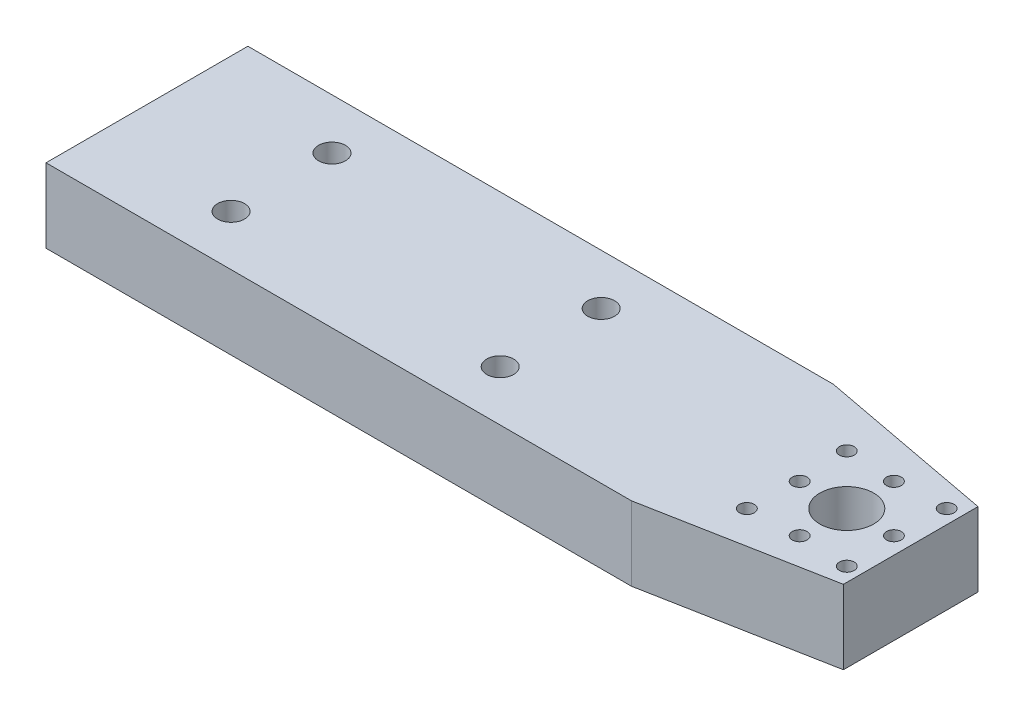
ISO-10303-21;
HEADER;
FILE_DESCRIPTION(('STEP AP214'),'2;1');
FILE_NAME('part.step','',(''),(''),'','','');
FILE_SCHEMA(('AUTOMOTIVE_DESIGN { 1 0 10303 214 1 1 1 1 }'));
ENDSEC;
DATA;
#1=APPLICATION_CONTEXT('core data for automotive mechanical design processes');
#2=APPLICATION_PROTOCOL_DEFINITION('international standard','automotive_design',2000,#1);
#3=PRODUCT_CONTEXT('',#1,'mechanical');
#4=PRODUCT('Part','Part','',(#3));
#5=PRODUCT_RELATED_PRODUCT_CATEGORY('part','',(#4));
#6=PRODUCT_DEFINITION_FORMATION('','',#4);
#7=PRODUCT_DEFINITION_CONTEXT('part definition',#1,'design');
#8=PRODUCT_DEFINITION('design','',#6,#7);
#9=PRODUCT_DEFINITION_SHAPE('','',#8);
#10=(LENGTH_UNIT() NAMED_UNIT(*) SI_UNIT(.MILLI.,.METRE.));
#11=(NAMED_UNIT(*) PLANE_ANGLE_UNIT() SI_UNIT($,.RADIAN.));
#12=(NAMED_UNIT(*) SI_UNIT($,.STERADIAN.) SOLID_ANGLE_UNIT());
#13=UNCERTAINTY_MEASURE_WITH_UNIT(LENGTH_MEASURE(1.E-05),#10,'distance_accuracy_value','');
#14=(GEOMETRIC_REPRESENTATION_CONTEXT(3) GLOBAL_UNCERTAINTY_ASSIGNED_CONTEXT((#13)) GLOBAL_UNIT_ASSIGNED_CONTEXT((#10,
#11,#12)) REPRESENTATION_CONTEXT('',''));
#15=CARTESIAN_POINT('',(0.,0.,0.));
#16=DIRECTION('',(0.,0.,1.));
#17=DIRECTION('',(1.,0.,0.));
#18=AXIS2_PLACEMENT_3D('',#15,#16,#17);
#19=CARTESIAN_POINT('',(78.8000166979834,11.,-20.));
#20=DIRECTION('',(-1.,0.,0.));
#21=DIRECTION('',(0.,0.,1.));
#22=AXIS2_PLACEMENT_3D('',#19,#20,#21);
#23=PLANE('',#22);
#24=DIRECTION('',(0.,0.,-1.));
#25=VECTOR('',#24,1.);
#26=CARTESIAN_POINT('',(78.8000166979834,0.,-20.));
#27=LINE('',#26,#25);
#28=CARTESIAN_POINT('',(78.8000166979834,0.,0.));
#29=VERTEX_POINT('',#28);
#30=CARTESIAN_POINT('',(78.8000166979834,0.,-20.));
#31=VERTEX_POINT('',#30);
#32=EDGE_CURVE('E179',#29,#31,#27,.T.);
#33=ORIENTED_EDGE('',*,*,#32,.T.);
#34=DIRECTION('',(0.,-1.,0.));
#35=VECTOR('',#34,1.);
#36=CARTESIAN_POINT('',(78.8000166979834,11.,-20.));
#37=LINE('',#36,#35);
#38=CARTESIAN_POINT('',(78.8000166979834,11.,-20.));
#39=VERTEX_POINT('',#38);
#40=EDGE_CURVE('E57',#39,#31,#37,.T.);
#41=ORIENTED_EDGE('',*,*,#40,.F.);
#42=DIRECTION('',(0.,0.,-1.));
#43=VECTOR('',#42,1.);
#44=CARTESIAN_POINT('',(78.8000166979834,11.,-20.));
#45=LINE('',#44,#43);
#46=CARTESIAN_POINT('',(78.8000166979834,11.,0.));
#47=VERTEX_POINT('',#46);
#48=EDGE_CURVE('E64',#47,#39,#45,.T.);
#49=ORIENTED_EDGE('',*,*,#48,.F.);
#50=DIRECTION('',(0.,-1.,0.));
#51=VECTOR('',#50,1.);
#52=CARTESIAN_POINT('',(78.8000166979834,11.,0.));
#53=LINE('',#52,#51);
#54=EDGE_CURVE('E12',#47,#29,#53,.T.);
#55=ORIENTED_EDGE('',*,*,#54,.T.);
#56=EDGE_LOOP('',(#33,#41,#49,#55));
#57=FACE_BOUND('',#56,.T.);
#58=ADVANCED_FACE('F48',(#57),#23,.F.);
#59=CARTESIAN_POINT('',(-41.1999833020166,11.,-10.));
#60=DIRECTION('',(0.,1.,0.));
#61=DIRECTION('',(0.,0.,1.));
#62=AXIS2_PLACEMENT_3D('',#59,#60,#61);
#63=PLANE('',#62);
#64=CARTESIAN_POINT('',(25.3000166979834,11.,-2.5));
#65=DIRECTION('',(0.,1.,0.));
#66=DIRECTION('',(0.,0.,1.));
#67=AXIS2_PLACEMENT_3D('',#64,#65,#66);
#68=CIRCLE('',#67,2.);
#69=CARTESIAN_POINT('',(25.3000166979834,11.,-0.499999999999996));
#70=VERTEX_POINT('',#69);
#71=EDGE_CURVE('E350',#70,#70,#68,.T.);
#72=ORIENTED_EDGE('',*,*,#71,.F.);
#73=EDGE_LOOP('',(#72));
#74=FACE_BOUND('',#73,.T.);
#75=CARTESIAN_POINT('',(-14.6999833020166,11.,-17.5));
#76=DIRECTION('',(0.,1.,0.));
#77=DIRECTION('',(0.,0.,1.));
#78=AXIS2_PLACEMENT_3D('',#75,#76,#77);
#79=CIRCLE('',#78,2.);
#80=CARTESIAN_POINT('',(-14.6999833020166,11.,-15.5));
#81=VERTEX_POINT('',#80);
#82=EDGE_CURVE('E355',#81,#81,#79,.T.);
#83=ORIENTED_EDGE('',*,*,#82,.F.);
#84=EDGE_LOOP('',(#83));
#85=FACE_BOUND('',#84,.T.);
#86=CARTESIAN_POINT('',(-14.6999833020166,11.,-2.49999999999999));
#87=DIRECTION('',(0.,1.,0.));
#88=DIRECTION('',(0.,0.,1.));
#89=AXIS2_PLACEMENT_3D('',#86,#87,#88);
#90=CIRCLE('',#89,2.);
#91=CARTESIAN_POINT('',(-14.6999833020166,11.,-0.499999999999992));
#92=VERTEX_POINT('',#91);
#93=EDGE_CURVE('E341',#92,#92,#90,.T.);
#94=ORIENTED_EDGE('',*,*,#93,.F.);
#95=EDGE_LOOP('',(#94));
#96=FACE_BOUND('',#95,.T.);
#97=CARTESIAN_POINT('',(25.3000166979834,11.,-17.5));
#98=DIRECTION('',(0.,1.,0.));
#99=DIRECTION('',(0.,0.,1.));
#100=AXIS2_PLACEMENT_3D('',#97,#98,#99);
#101=CIRCLE('',#100,2.);
#102=CARTESIAN_POINT('',(25.3000166979834,11.,-15.5));
#103=VERTEX_POINT('',#102);
#104=EDGE_CURVE('E130',#103,#103,#101,.T.);
#105=ORIENTED_EDGE('',*,*,#104,.F.);
#106=EDGE_LOOP('',(#105));
#107=FACE_BOUND('',#106,.T.);
#108=DIRECTION('',(0.,0.,-1.));
#109=VECTOR('',#108,1.);
#110=CARTESIAN_POINT('',(-34.6999833020166,11.,-10.));
#111=LINE('',#110,#109);
#112=CARTESIAN_POINT('',(-34.6999833020166,11.,5.));
#113=VERTEX_POINT('',#112);
#114=CARTESIAN_POINT('',(-34.6999833020166,11.,-25.));
#115=VERTEX_POINT('',#114);
#116=EDGE_CURVE('E111',#113,#115,#111,.T.);
#117=ORIENTED_EDGE('',*,*,#116,.F.);
#118=DIRECTION('',(1.,0.,0.));
#119=VECTOR('',#118,1.);
#120=CARTESIAN_POINT('',(0.,11.,4.99999999999998));
#121=LINE('',#120,#119);
#122=CARTESIAN_POINT('',(52.3000166979834,11.,4.99999999999995));
#123=VERTEX_POINT('',#122);
#124=EDGE_CURVE('E119',#113,#123,#121,.T.);
#125=ORIENTED_EDGE('',*,*,#124,.T.);
#126=DIRECTION('',(0.982661653748471,0.,-0.185407859197823));
#127=VECTOR('',#126,1.);
#128=CARTESIAN_POINT('',(2.70883522509392,11.,14.3568266929979));
#129=LINE('',#128,#127);
#130=EDGE_CURVE('E125',#123,#47,#129,.T.);
#131=ORIENTED_EDGE('',*,*,#130,.T.);
#132=ORIENTED_EDGE('',*,*,#48,.T.);
#133=DIRECTION('',(-0.982661653748471,0.,-0.185407859197823));
#134=VECTOR('',#133,1.);
#135=CARTESIAN_POINT('',(6.35269909583984,11.,-33.6693052079515));
#136=LINE('',#135,#134);
#137=CARTESIAN_POINT('',(52.3000166979834,11.,-25.));
#138=VERTEX_POINT('',#137);
#139=EDGE_CURVE('E135',#39,#138,#136,.T.);
#140=ORIENTED_EDGE('',*,*,#139,.T.);
#141=DIRECTION('',(-1.,0.,0.));
#142=VECTOR('',#141,1.);
#143=CARTESIAN_POINT('',(0.,11.,-25.));
#144=LINE('',#143,#142);
#145=EDGE_CURVE('E141',#138,#115,#144,.T.);
#146=ORIENTED_EDGE('',*,*,#145,.T.);
#147=EDGE_LOOP('',(#117,#125,#131,#132,#140,#146));
#148=FACE_BOUND('',#147,.T.);
#149=CARTESIAN_POINT('',(69.3000166979834,11.,-17.));
#150=DIRECTION('',(0.,1.,0.));
#151=DIRECTION('',(0.,0.,1.));
#152=AXIS2_PLACEMENT_3D('',#149,#150,#151);
#153=CIRCLE('',#152,1.10000000000001);
#154=CARTESIAN_POINT('',(69.3000166979834,11.,-15.9));
#155=VERTEX_POINT('',#154);
#156=EDGE_CURVE('E163',#155,#155,#153,.T.);
#157=ORIENTED_EDGE('',*,*,#156,.F.);
#158=EDGE_LOOP('',(#157));
#159=FACE_BOUND('',#158,.T.);
#160=CARTESIAN_POINT('',(76.7246379004422,11.,-17.4246212024586));
#161=DIRECTION('',(0.,1.,0.));
#162=DIRECTION('',(0.,0.,1.));
#163=AXIS2_PLACEMENT_3D('',#160,#161,#162);
#164=CIRCLE('',#163,1.10000000000001);
#165=CARTESIAN_POINT('',(76.7246379004422,11.,-16.3246212024586));
#166=VERTEX_POINT('',#165);
#167=EDGE_CURVE('E167',#166,#166,#164,.T.);
#168=ORIENTED_EDGE('',*,*,#167,.F.);
#169=EDGE_LOOP('',(#168));
#170=FACE_BOUND('',#169,.T.);
#171=CARTESIAN_POINT('',(76.3000166979834,11.,-9.99999999999998));
#172=DIRECTION('',(0.,1.,0.));
#173=DIRECTION('',(0.,0.,1.));
#174=AXIS2_PLACEMENT_3D('',#171,#172,#173);
#175=CIRCLE('',#174,1.10000000000001);
#176=CARTESIAN_POINT('',(76.3000166979834,11.,-8.89999999999998));
#177=VERTEX_POINT('',#176);
#178=EDGE_CURVE('E170',#177,#177,#175,.T.);
#179=ORIENTED_EDGE('',*,*,#178,.F.);
#180=EDGE_LOOP('',(#179));
#181=FACE_BOUND('',#180,.T.);
#182=CARTESIAN_POINT('',(76.7246379004422,11.,-2.57537879754115));
#183=DIRECTION('',(0.,1.,0.));
#184=DIRECTION('',(0.,0.,1.));
#185=AXIS2_PLACEMENT_3D('',#182,#183,#184);
#186=CIRCLE('',#185,1.10000000000001);
#187=CARTESIAN_POINT('',(76.7246379004422,11.,-1.47537879754114));
#188=VERTEX_POINT('',#187);
#189=EDGE_CURVE('E154',#188,#188,#186,.T.);
#190=ORIENTED_EDGE('',*,*,#189,.F.);
#191=EDGE_LOOP('',(#190));
#192=FACE_BOUND('',#191,.T.);
#193=CARTESIAN_POINT('',(69.3000166979834,11.,-2.99999999999999));
#194=DIRECTION('',(0.,1.,0.));
#195=DIRECTION('',(0.,0.,1.));
#196=AXIS2_PLACEMENT_3D('',#193,#194,#195);
#197=CIRCLE('',#196,1.10000000000001);
#198=CARTESIAN_POINT('',(69.3000166979834,11.,-1.89999999999999));
#199=VERTEX_POINT('',#198);
#200=EDGE_CURVE('E151',#199,#199,#197,.T.);
#201=ORIENTED_EDGE('',*,*,#200,.F.);
#202=EDGE_LOOP('',(#201));
#203=FACE_BOUND('',#202,.T.);
#204=CARTESIAN_POINT('',(61.8753954955247,11.,-2.57537879754114));
#205=DIRECTION('',(0.,1.,0.));
#206=DIRECTION('',(0.,0.,1.));
#207=AXIS2_PLACEMENT_3D('',#204,#205,#206);
#208=CIRCLE('',#207,1.10000000000001);
#209=CARTESIAN_POINT('',(61.8753954955247,11.,-1.47537879754114));
#210=VERTEX_POINT('',#209);
#211=EDGE_CURVE('E155',#210,#210,#208,.T.);
#212=ORIENTED_EDGE('',*,*,#211,.F.);
#213=EDGE_LOOP('',(#212));
#214=FACE_BOUND('',#213,.T.);
#215=CARTESIAN_POINT('',(62.3000166979834,11.,-10.));
#216=DIRECTION('',(0.,1.,0.));
#217=DIRECTION('',(0.,0.,1.));
#218=AXIS2_PLACEMENT_3D('',#215,#216,#217);
#219=CIRCLE('',#218,1.10000000000001);
#220=CARTESIAN_POINT('',(62.3000166979834,11.,-8.89999999999999));
#221=VERTEX_POINT('',#220);
#222=EDGE_CURVE('E158',#221,#221,#219,.T.);
#223=ORIENTED_EDGE('',*,*,#222,.F.);
#224=EDGE_LOOP('',(#223));
#225=FACE_BOUND('',#224,.T.);
#226=CARTESIAN_POINT('',(69.3000166979834,11.,-10.));
#227=DIRECTION('',(0.,1.,0.));
#228=DIRECTION('',(0.,0.,1.));
#229=AXIS2_PLACEMENT_3D('',#226,#227,#228);
#230=CIRCLE('',#229,4.00000000000001);
#231=CARTESIAN_POINT('',(69.3000166979834,11.,-5.99999999999999));
#232=VERTEX_POINT('',#231);
#233=EDGE_CURVE('E150',#232,#232,#230,.T.);
#234=ORIENTED_EDGE('',*,*,#233,.F.);
#235=EDGE_LOOP('',(#234));
#236=FACE_BOUND('',#235,.T.);
#237=CARTESIAN_POINT('',(61.8753954955247,11.,-17.4246212024586));
#238=DIRECTION('',(0.,1.,0.));
#239=DIRECTION('',(0.,0.,1.));
#240=AXIS2_PLACEMENT_3D('',#237,#238,#239);
#241=CIRCLE('',#240,1.10000000000001);
#242=CARTESIAN_POINT('',(61.8753954955247,11.,-16.3246212024586));
#243=VERTEX_POINT('',#242);
#244=EDGE_CURVE('E166',#243,#243,#241,.T.);
#245=ORIENTED_EDGE('',*,*,#244,.F.);
#246=EDGE_LOOP('',(#245));
#247=FACE_BOUND('',#246,.T.);
#248=ADVANCED_FACE('F226',(#74,#85,#96,#107,#148,#159,#170,#181,#192,#203,#214,#225,#236,#247),
#63,.T.);
#249=CARTESIAN_POINT('',(-41.1999833020166,0.,-10.));
#250=DIRECTION('',(0.,1.,0.));
#251=DIRECTION('',(0.,0.,1.));
#252=AXIS2_PLACEMENT_3D('',#249,#250,#251);
#253=PLANE('',#252);
#254=CARTESIAN_POINT('',(25.3000166979834,0.,-2.5));
#255=DIRECTION('',(0.,1.,0.));
#256=DIRECTION('',(0.,0.,1.));
#257=AXIS2_PLACEMENT_3D('',#254,#255,#256);
#258=CIRCLE('',#257,2.);
#259=CARTESIAN_POINT('',(25.3000166979834,0.,-0.499999999999996));
#260=VERTEX_POINT('',#259);
#261=EDGE_CURVE('E353',#260,#260,#258,.T.);
#262=ORIENTED_EDGE('',*,*,#261,.T.);
#263=EDGE_LOOP('',(#262));
#264=FACE_BOUND('',#263,.T.);
#265=CARTESIAN_POINT('',(-14.6999833020166,0.,-17.5));
#266=DIRECTION('',(0.,1.,0.));
#267=DIRECTION('',(0.,0.,1.));
#268=AXIS2_PLACEMENT_3D('',#265,#266,#267);
#269=CIRCLE('',#268,2.);
#270=CARTESIAN_POINT('',(-14.6999833020166,0.,-15.5));
#271=VERTEX_POINT('',#270);
#272=EDGE_CURVE('E347',#271,#271,#269,.T.);
#273=ORIENTED_EDGE('',*,*,#272,.T.);
#274=EDGE_LOOP('',(#273));
#275=FACE_BOUND('',#274,.T.);
#276=CARTESIAN_POINT('',(-14.6999833020166,0.,-2.49999999999999));
#277=DIRECTION('',(0.,1.,0.));
#278=DIRECTION('',(0.,0.,1.));
#279=AXIS2_PLACEMENT_3D('',#276,#277,#278);
#280=CIRCLE('',#279,2.);
#281=CARTESIAN_POINT('',(-14.6999833020166,0.,-0.499999999999992));
#282=VERTEX_POINT('',#281);
#283=EDGE_CURVE('E344',#282,#282,#280,.T.);
#284=ORIENTED_EDGE('',*,*,#283,.T.);
#285=EDGE_LOOP('',(#284));
#286=FACE_BOUND('',#285,.T.);
#287=CARTESIAN_POINT('',(25.3000166979834,0.,-17.5));
#288=DIRECTION('',(0.,1.,0.));
#289=DIRECTION('',(0.,0.,1.));
#290=AXIS2_PLACEMENT_3D('',#287,#288,#289);
#291=CIRCLE('',#290,2.);
#292=CARTESIAN_POINT('',(25.3000166979834,0.,-15.5));
#293=VERTEX_POINT('',#292);
#294=EDGE_CURVE('E133',#293,#293,#291,.T.);
#295=ORIENTED_EDGE('',*,*,#294,.T.);
#296=EDGE_LOOP('',(#295));
#297=FACE_BOUND('',#296,.T.);
#298=CARTESIAN_POINT('',(69.3000166979834,0.,-17.));
#299=DIRECTION('',(0.,1.,0.));
#300=DIRECTION('',(0.,0.,1.));
#301=AXIS2_PLACEMENT_3D('',#298,#299,#300);
#302=CIRCLE('',#301,1.10000000000001);
#303=CARTESIAN_POINT('',(69.3000166979834,0.,-15.9));
#304=VERTEX_POINT('',#303);
#305=EDGE_CURVE('E51',#304,#304,#302,.T.);
#306=ORIENTED_EDGE('',*,*,#305,.T.);
#307=EDGE_LOOP('',(#306));
#308=FACE_BOUND('',#307,.T.);
#309=CARTESIAN_POINT('',(76.7246379004422,0.,-17.4246212024586));
#310=DIRECTION('',(0.,1.,0.));
#311=DIRECTION('',(0.,0.,1.));
#312=AXIS2_PLACEMENT_3D('',#309,#310,#311);
#313=CIRCLE('',#312,1.10000000000001);
#314=CARTESIAN_POINT('',(76.7246379004422,0.,-16.3246212024586));
#315=VERTEX_POINT('',#314);
#316=EDGE_CURVE('E202',#315,#315,#313,.T.);
#317=ORIENTED_EDGE('',*,*,#316,.T.);
#318=EDGE_LOOP('',(#317));
#319=FACE_BOUND('',#318,.T.);
#320=CARTESIAN_POINT('',(76.3000166979834,0.,-9.99999999999998));
#321=DIRECTION('',(0.,1.,0.));
#322=DIRECTION('',(0.,0.,1.));
#323=AXIS2_PLACEMENT_3D('',#320,#321,#322);
#324=CIRCLE('',#323,1.10000000000001);
#325=CARTESIAN_POINT('',(76.3000166979834,0.,-8.89999999999998));
#326=VERTEX_POINT('',#325);
#327=EDGE_CURVE('E200',#326,#326,#324,.T.);
#328=ORIENTED_EDGE('',*,*,#327,.T.);
#329=EDGE_LOOP('',(#328));
#330=FACE_BOUND('',#329,.T.);
#331=CARTESIAN_POINT('',(76.7246379004422,0.,-2.57537879754115));
#332=DIRECTION('',(0.,1.,0.));
#333=DIRECTION('',(0.,0.,1.));
#334=AXIS2_PLACEMENT_3D('',#331,#332,#333);
#335=CIRCLE('',#334,1.10000000000001);
#336=CARTESIAN_POINT('',(76.7246379004422,0.,-1.47537879754114));
#337=VERTEX_POINT('',#336);
#338=EDGE_CURVE('E197',#337,#337,#335,.T.);
#339=ORIENTED_EDGE('',*,*,#338,.T.);
#340=EDGE_LOOP('',(#339));
#341=FACE_BOUND('',#340,.T.);
#342=CARTESIAN_POINT('',(69.3000166979834,0.,-2.99999999999999));
#343=DIRECTION('',(0.,1.,0.));
#344=DIRECTION('',(0.,0.,1.));
#345=AXIS2_PLACEMENT_3D('',#342,#343,#344);
#346=CIRCLE('',#345,1.10000000000001);
#347=CARTESIAN_POINT('',(69.3000166979834,0.,-1.89999999999999));
#348=VERTEX_POINT('',#347);
#349=EDGE_CURVE('E194',#348,#348,#346,.T.);
#350=ORIENTED_EDGE('',*,*,#349,.T.);
#351=EDGE_LOOP('',(#350));
#352=FACE_BOUND('',#351,.T.);
#353=CARTESIAN_POINT('',(61.8753954955247,0.,-2.57537879754114));
#354=DIRECTION('',(0.,1.,0.));
#355=DIRECTION('',(0.,0.,1.));
#356=AXIS2_PLACEMENT_3D('',#353,#354,#355);
#357=CIRCLE('',#356,1.10000000000001);
#358=CARTESIAN_POINT('',(61.8753954955247,0.,-1.47537879754114));
#359=VERTEX_POINT('',#358);
#360=EDGE_CURVE('E191',#359,#359,#357,.T.);
#361=ORIENTED_EDGE('',*,*,#360,.T.);
#362=EDGE_LOOP('',(#361));
#363=FACE_BOUND('',#362,.T.);
#364=CARTESIAN_POINT('',(62.3000166979834,0.,-10.));
#365=DIRECTION('',(0.,1.,0.));
#366=DIRECTION('',(0.,0.,1.));
#367=AXIS2_PLACEMENT_3D('',#364,#365,#366);
#368=CIRCLE('',#367,1.10000000000001);
#369=CARTESIAN_POINT('',(62.3000166979834,0.,-8.89999999999999));
#370=VERTEX_POINT('',#369);
#371=EDGE_CURVE('E188',#370,#370,#368,.T.);
#372=ORIENTED_EDGE('',*,*,#371,.T.);
#373=EDGE_LOOP('',(#372));
#374=FACE_BOUND('',#373,.T.);
#375=CARTESIAN_POINT('',(69.3000166979834,0.,-10.));
#376=DIRECTION('',(0.,1.,0.));
#377=DIRECTION('',(0.,0.,1.));
#378=AXIS2_PLACEMENT_3D('',#375,#376,#377);
#379=CIRCLE('',#378,4.00000000000001);
#380=CARTESIAN_POINT('',(69.3000166979834,0.,-5.99999999999999));
#381=VERTEX_POINT('',#380);
#382=EDGE_CURVE('E185',#381,#381,#379,.T.);
#383=ORIENTED_EDGE('',*,*,#382,.T.);
#384=EDGE_LOOP('',(#383));
#385=FACE_BOUND('',#384,.T.);
#386=CARTESIAN_POINT('',(61.8753954955247,0.,-17.4246212024586));
#387=DIRECTION('',(0.,1.,0.));
#388=DIRECTION('',(0.,0.,1.));
#389=AXIS2_PLACEMENT_3D('',#386,#387,#388);
#390=CIRCLE('',#389,1.10000000000001);
#391=CARTESIAN_POINT('',(61.8753954955247,0.,-16.3246212024586));
#392=VERTEX_POINT('',#391);
#393=EDGE_CURVE('E177',#392,#392,#390,.T.);
#394=ORIENTED_EDGE('',*,*,#393,.T.);
#395=EDGE_LOOP('',(#394));
#396=FACE_BOUND('',#395,.T.);
#397=ORIENTED_EDGE('',*,*,#32,.F.);
#398=DIRECTION('',(0.982661653748471,0.,-0.185407859197823));
#399=VECTOR('',#398,1.);
#400=CARTESIAN_POINT('',(2.70883522509392,0.,14.3568266929979));
#401=LINE('',#400,#399);
#402=CARTESIAN_POINT('',(52.3000166979834,0.,4.99999999999995));
#403=VERTEX_POINT('',#402);
#404=EDGE_CURVE('E121',#403,#29,#401,.T.);
#405=ORIENTED_EDGE('',*,*,#404,.F.);
#406=DIRECTION('',(1.,0.,0.));
#407=VECTOR('',#406,1.);
#408=CARTESIAN_POINT('',(0.,0.,4.99999999999998));
#409=LINE('',#408,#407);
#410=CARTESIAN_POINT('',(-34.6999833020166,0.,5.));
#411=VERTEX_POINT('',#410);
#412=EDGE_CURVE('E116',#411,#403,#409,.T.);
#413=ORIENTED_EDGE('',*,*,#412,.F.);
#414=DIRECTION('',(0.,0.,1.));
#415=VECTOR('',#414,1.);
#416=CARTESIAN_POINT('',(-34.6999833020166,0.,0.));
#417=LINE('',#416,#415);
#418=CARTESIAN_POINT('',(-34.6999833020166,0.,-25.));
#419=VERTEX_POINT('',#418);
#420=EDGE_CURVE('E100',#419,#411,#417,.T.);
#421=ORIENTED_EDGE('',*,*,#420,.F.);
#422=DIRECTION('',(-1.,0.,0.));
#423=VECTOR('',#422,1.);
#424=CARTESIAN_POINT('',(0.,0.,-25.));
#425=LINE('',#424,#423);
#426=CARTESIAN_POINT('',(52.3000166979834,0.,-25.));
#427=VERTEX_POINT('',#426);
#428=EDGE_CURVE('E140',#427,#419,#425,.T.);
#429=ORIENTED_EDGE('',*,*,#428,.F.);
#430=DIRECTION('',(-0.982661653748471,0.,-0.185407859197823));
#431=VECTOR('',#430,1.);
#432=CARTESIAN_POINT('',(6.35269909583984,0.,-33.6693052079515));
#433=LINE('',#432,#431);
#434=EDGE_CURVE('E137',#31,#427,#433,.T.);
#435=ORIENTED_EDGE('',*,*,#434,.F.);
#436=EDGE_LOOP('',(#397,#405,#413,#421,#429,#435));
#437=FACE_BOUND('',#436,.T.);
#438=ADVANCED_FACE('F124',(#264,#275,#286,#297,#308,#319,#330,#341,#352,#363,#374,#385,#396,
#437),#253,.F.);
#439=CARTESIAN_POINT('',(61.8753954955247,-9.,-17.4246212024586));
#440=DIRECTION('',(0.,1.,0.));
#441=DIRECTION('',(0.,0.,1.));
#442=AXIS2_PLACEMENT_3D('',#439,#440,#441);
#443=CYLINDRICAL_SURFACE('',#442,1.10000000000001);
#444=ORIENTED_EDGE('',*,*,#244,.T.);
#445=EDGE_LOOP('',(#444));
#446=FACE_BOUND('',#445,.T.);
#447=ORIENTED_EDGE('',*,*,#393,.F.);
#448=EDGE_LOOP('',(#447));
#449=FACE_BOUND('',#448,.T.);
#450=ADVANCED_FACE('F258',(#446,#449),#443,.F.);
#451=CARTESIAN_POINT('',(69.3000166979834,-9.,-10.));
#452=DIRECTION('',(0.,1.,0.));
#453=DIRECTION('',(0.,0.,1.));
#454=AXIS2_PLACEMENT_3D('',#451,#452,#453);
#455=CYLINDRICAL_SURFACE('',#454,4.00000000000001);
#456=ORIENTED_EDGE('',*,*,#233,.T.);
#457=EDGE_LOOP('',(#456));
#458=FACE_BOUND('',#457,.T.);
#459=ORIENTED_EDGE('',*,*,#382,.F.);
#460=EDGE_LOOP('',(#459));
#461=FACE_BOUND('',#460,.T.);
#462=ADVANCED_FACE('F261',(#458,#461),#455,.F.);
#463=CARTESIAN_POINT('',(62.3000166979834,-9.,-10.));
#464=DIRECTION('',(0.,1.,0.));
#465=DIRECTION('',(0.,0.,1.));
#466=AXIS2_PLACEMENT_3D('',#463,#464,#465);
#467=CYLINDRICAL_SURFACE('',#466,1.10000000000001);
#468=ORIENTED_EDGE('',*,*,#222,.T.);
#469=EDGE_LOOP('',(#468));
#470=FACE_BOUND('',#469,.T.);
#471=ORIENTED_EDGE('',*,*,#371,.F.);
#472=EDGE_LOOP('',(#471));
#473=FACE_BOUND('',#472,.T.);
#474=ADVANCED_FACE('F296',(#470,#473),#467,.F.);
#475=CARTESIAN_POINT('',(61.8753954955247,-9.,-2.57537879754114));
#476=DIRECTION('',(0.,1.,0.));
#477=DIRECTION('',(0.,0.,1.));
#478=AXIS2_PLACEMENT_3D('',#475,#476,#477);
#479=CYLINDRICAL_SURFACE('',#478,1.10000000000001);
#480=ORIENTED_EDGE('',*,*,#211,.T.);
#481=EDGE_LOOP('',(#480));
#482=FACE_BOUND('',#481,.T.);
#483=ORIENTED_EDGE('',*,*,#360,.F.);
#484=EDGE_LOOP('',(#483));
#485=FACE_BOUND('',#484,.T.);
#486=ADVANCED_FACE('F301',(#482,#485),#479,.F.);
#487=CARTESIAN_POINT('',(69.3000166979834,-9.,-2.99999999999999));
#488=DIRECTION('',(0.,1.,0.));
#489=DIRECTION('',(0.,0.,1.));
#490=AXIS2_PLACEMENT_3D('',#487,#488,#489);
#491=CYLINDRICAL_SURFACE('',#490,1.10000000000001);
#492=ORIENTED_EDGE('',*,*,#200,.T.);
#493=EDGE_LOOP('',(#492));
#494=FACE_BOUND('',#493,.T.);
#495=ORIENTED_EDGE('',*,*,#349,.F.);
#496=EDGE_LOOP('',(#495));
#497=FACE_BOUND('',#496,.T.);
#498=ADVANCED_FACE('F275',(#494,#497),#491,.F.);
#499=CARTESIAN_POINT('',(76.7246379004422,-9.,-2.57537879754115));
#500=DIRECTION('',(0.,1.,0.));
#501=DIRECTION('',(0.,0.,1.));
#502=AXIS2_PLACEMENT_3D('',#499,#500,#501);
#503=CYLINDRICAL_SURFACE('',#502,1.10000000000001);
#504=ORIENTED_EDGE('',*,*,#189,.T.);
#505=EDGE_LOOP('',(#504));
#506=FACE_BOUND('',#505,.T.);
#507=ORIENTED_EDGE('',*,*,#338,.F.);
#508=EDGE_LOOP('',(#507));
#509=FACE_BOUND('',#508,.T.);
#510=ADVANCED_FACE('F272',(#506,#509),#503,.F.);
#511=CARTESIAN_POINT('',(76.3000166979834,-9.,-9.99999999999998));
#512=DIRECTION('',(0.,1.,0.));
#513=DIRECTION('',(0.,0.,1.));
#514=AXIS2_PLACEMENT_3D('',#511,#512,#513);
#515=CYLINDRICAL_SURFACE('',#514,1.10000000000001);
#516=ORIENTED_EDGE('',*,*,#178,.T.);
#517=EDGE_LOOP('',(#516));
#518=FACE_BOUND('',#517,.T.);
#519=ORIENTED_EDGE('',*,*,#327,.F.);
#520=EDGE_LOOP('',(#519));
#521=FACE_BOUND('',#520,.T.);
#522=ADVANCED_FACE('F221',(#518,#521),#515,.F.);
#523=CARTESIAN_POINT('',(76.7246379004422,-9.,-17.4246212024586));
#524=DIRECTION('',(0.,1.,0.));
#525=DIRECTION('',(0.,0.,1.));
#526=AXIS2_PLACEMENT_3D('',#523,#524,#525);
#527=CYLINDRICAL_SURFACE('',#526,1.10000000000001);
#528=ORIENTED_EDGE('',*,*,#167,.T.);
#529=EDGE_LOOP('',(#528));
#530=FACE_BOUND('',#529,.T.);
#531=ORIENTED_EDGE('',*,*,#316,.F.);
#532=EDGE_LOOP('',(#531));
#533=FACE_BOUND('',#532,.T.);
#534=ADVANCED_FACE('F212',(#530,#533),#527,.F.);
#535=CARTESIAN_POINT('',(69.3000166979834,-9.,-17.));
#536=DIRECTION('',(0.,1.,0.));
#537=DIRECTION('',(0.,0.,1.));
#538=AXIS2_PLACEMENT_3D('',#535,#536,#537);
#539=CYLINDRICAL_SURFACE('',#538,1.10000000000001);
#540=ORIENTED_EDGE('',*,*,#156,.T.);
#541=EDGE_LOOP('',(#540));
#542=FACE_BOUND('',#541,.T.);
#543=ORIENTED_EDGE('',*,*,#305,.F.);
#544=EDGE_LOOP('',(#543));
#545=FACE_BOUND('',#544,.T.);
#546=ADVANCED_FACE('F210',(#542,#545),#539,.F.);
#547=CARTESIAN_POINT('',(-34.6999833020166,20.,0.));
#548=DIRECTION('',(1.,0.,0.));
#549=DIRECTION('',(0.,0.,-1.));
#550=AXIS2_PLACEMENT_3D('',#547,#548,#549);
#551=PLANE('',#550);
#552=ORIENTED_EDGE('',*,*,#116,.T.);
#553=DIRECTION('',(0.,1.,0.));
#554=VECTOR('',#553,1.);
#555=CARTESIAN_POINT('',(-34.6999833020166,0.,-25.));
#556=LINE('',#555,#554);
#557=EDGE_CURVE('E106',#419,#115,#556,.T.);
#558=ORIENTED_EDGE('',*,*,#557,.F.);
#559=ORIENTED_EDGE('',*,*,#420,.T.);
#560=DIRECTION('',(0.,1.,0.));
#561=VECTOR('',#560,1.);
#562=CARTESIAN_POINT('',(-34.6999833020166,0.,5.));
#563=LINE('',#562,#561);
#564=EDGE_CURVE('E103',#411,#113,#563,.T.);
#565=ORIENTED_EDGE('',*,*,#564,.T.);
#566=EDGE_LOOP('',(#552,#558,#559,#565));
#567=FACE_BOUND('',#566,.T.);
#568=ADVANCED_FACE('F102',(#567),#551,.F.);
#569=CARTESIAN_POINT('',(0.,0.,-25.));
#570=DIRECTION('',(0.,0.,-1.));
#571=DIRECTION('',(-1.,0.,0.));
#572=AXIS2_PLACEMENT_3D('',#569,#570,#571);
#573=PLANE('',#572);
#574=ORIENTED_EDGE('',*,*,#145,.F.);
#575=DIRECTION('',(0.,1.,0.));
#576=VECTOR('',#575,1.);
#577=CARTESIAN_POINT('',(52.3000166979834,0.,-25.));
#578=LINE('',#577,#576);
#579=EDGE_CURVE('E143',#427,#138,#578,.T.);
#580=ORIENTED_EDGE('',*,*,#579,.F.);
#581=ORIENTED_EDGE('',*,*,#428,.T.);
#582=ORIENTED_EDGE('',*,*,#557,.T.);
#583=EDGE_LOOP('',(#574,#580,#581,#582));
#584=FACE_BOUND('',#583,.T.);
#585=ADVANCED_FACE('F219',(#584),#573,.T.);
#586=CARTESIAN_POINT('',(6.35269909583984,0.,-33.6693052079515));
#587=DIRECTION('',(0.185407859197823,0.,-0.982661653748471));
#588=DIRECTION('',(-0.982661653748471,0.,-0.185407859197823));
#589=AXIS2_PLACEMENT_3D('',#586,#587,#588);
#590=PLANE('',#589);
#591=ORIENTED_EDGE('',*,*,#139,.F.);
#592=ORIENTED_EDGE('',*,*,#40,.T.);
#593=ORIENTED_EDGE('',*,*,#434,.T.);
#594=ORIENTED_EDGE('',*,*,#579,.T.);
#595=EDGE_LOOP('',(#591,#592,#593,#594));
#596=FACE_BOUND('',#595,.T.);
#597=ADVANCED_FACE('F236',(#596),#590,.T.);
#598=CARTESIAN_POINT('',(2.70883522509392,0.,14.3568266929979));
#599=DIRECTION('',(0.185407859197823,0.,0.982661653748471));
#600=DIRECTION('',(0.982661653748471,0.,-0.185407859197823));
#601=AXIS2_PLACEMENT_3D('',#598,#599,#600);
#602=PLANE('',#601);
#603=ORIENTED_EDGE('',*,*,#130,.F.);
#604=DIRECTION('',(0.,1.,0.));
#605=VECTOR('',#604,1.);
#606=CARTESIAN_POINT('',(52.3000166979834,0.,4.99999999999995));
#607=LINE('',#606,#605);
#608=EDGE_CURVE('E120',#403,#123,#607,.T.);
#609=ORIENTED_EDGE('',*,*,#608,.F.);
#610=ORIENTED_EDGE('',*,*,#404,.T.);
#611=ORIENTED_EDGE('',*,*,#54,.F.);
#612=EDGE_LOOP('',(#603,#609,#610,#611));
#613=FACE_BOUND('',#612,.T.);
#614=ADVANCED_FACE('F313',(#613),#602,.T.);
#615=CARTESIAN_POINT('',(0.,0.,4.99999999999998));
#616=DIRECTION('',(0.,0.,1.));
#617=DIRECTION('',(1.,0.,0.));
#618=AXIS2_PLACEMENT_3D('',#615,#616,#617);
#619=PLANE('',#618);
#620=ORIENTED_EDGE('',*,*,#124,.F.);
#621=ORIENTED_EDGE('',*,*,#564,.F.);
#622=ORIENTED_EDGE('',*,*,#412,.T.);
#623=ORIENTED_EDGE('',*,*,#608,.T.);
#624=EDGE_LOOP('',(#620,#621,#622,#623));
#625=FACE_BOUND('',#624,.T.);
#626=ADVANCED_FACE('F115',(#625),#619,.T.);
#627=CARTESIAN_POINT('',(25.3000166979834,0.,-17.5));
#628=DIRECTION('',(0.,1.,0.));
#629=DIRECTION('',(0.,0.,1.));
#630=AXIS2_PLACEMENT_3D('',#627,#628,#629);
#631=CYLINDRICAL_SURFACE('',#630,2.);
#632=ORIENTED_EDGE('',*,*,#294,.F.);
#633=EDGE_LOOP('',(#632));
#634=FACE_BOUND('',#633,.T.);
#635=ORIENTED_EDGE('',*,*,#104,.T.);
#636=EDGE_LOOP('',(#635));
#637=FACE_BOUND('',#636,.T.);
#638=ADVANCED_FACE('F318',(#634,#637),#631,.F.);
#639=CARTESIAN_POINT('',(-14.6999833020166,0.,-2.49999999999999));
#640=DIRECTION('',(0.,1.,0.));
#641=DIRECTION('',(0.,0.,1.));
#642=AXIS2_PLACEMENT_3D('',#639,#640,#641);
#643=CYLINDRICAL_SURFACE('',#642,2.);
#644=ORIENTED_EDGE('',*,*,#93,.T.);
#645=EDGE_LOOP('',(#644));
#646=FACE_BOUND('',#645,.T.);
#647=ORIENTED_EDGE('',*,*,#283,.F.);
#648=EDGE_LOOP('',(#647));
#649=FACE_BOUND('',#648,.T.);
#650=ADVANCED_FACE('F324',(#646,#649),#643,.F.);
#651=CARTESIAN_POINT('',(-14.6999833020166,0.,-17.5));
#652=DIRECTION('',(0.,1.,0.));
#653=DIRECTION('',(0.,0.,1.));
#654=AXIS2_PLACEMENT_3D('',#651,#652,#653);
#655=CYLINDRICAL_SURFACE('',#654,2.);
#656=ORIENTED_EDGE('',*,*,#272,.F.);
#657=EDGE_LOOP('',(#656));
#658=FACE_BOUND('',#657,.T.);
#659=ORIENTED_EDGE('',*,*,#82,.T.);
#660=EDGE_LOOP('',(#659));
#661=FACE_BOUND('',#660,.T.);
#662=ADVANCED_FACE('F326',(#658,#661),#655,.F.);
#663=CARTESIAN_POINT('',(25.3000166979834,0.,-2.5));
#664=DIRECTION('',(0.,1.,0.));
#665=DIRECTION('',(0.,0.,1.));
#666=AXIS2_PLACEMENT_3D('',#663,#664,#665);
#667=CYLINDRICAL_SURFACE('',#666,2.);
#668=ORIENTED_EDGE('',*,*,#261,.F.);
#669=EDGE_LOOP('',(#668));
#670=FACE_BOUND('',#669,.T.);
#671=ORIENTED_EDGE('',*,*,#71,.T.);
#672=EDGE_LOOP('',(#671));
#673=FACE_BOUND('',#672,.T.);
#674=ADVANCED_FACE('F329',(#670,#673),#667,.F.);
#675=CLOSED_SHELL('',(#58,#248,#438,#450,#462,#474,#486,#498,#510,#522,#534,#546,#568,#585,#597,
#614,#626,#638,#650,#662,#674));
#676=MANIFOLD_SOLID_BREP('B2',#675);
#677=ADVANCED_BREP_SHAPE_REPRESENTATION('',(#18,#676),#14);
#678=SHAPE_DEFINITION_REPRESENTATION(#9,#677);
ENDSEC;
END-ISO-10303-21;
